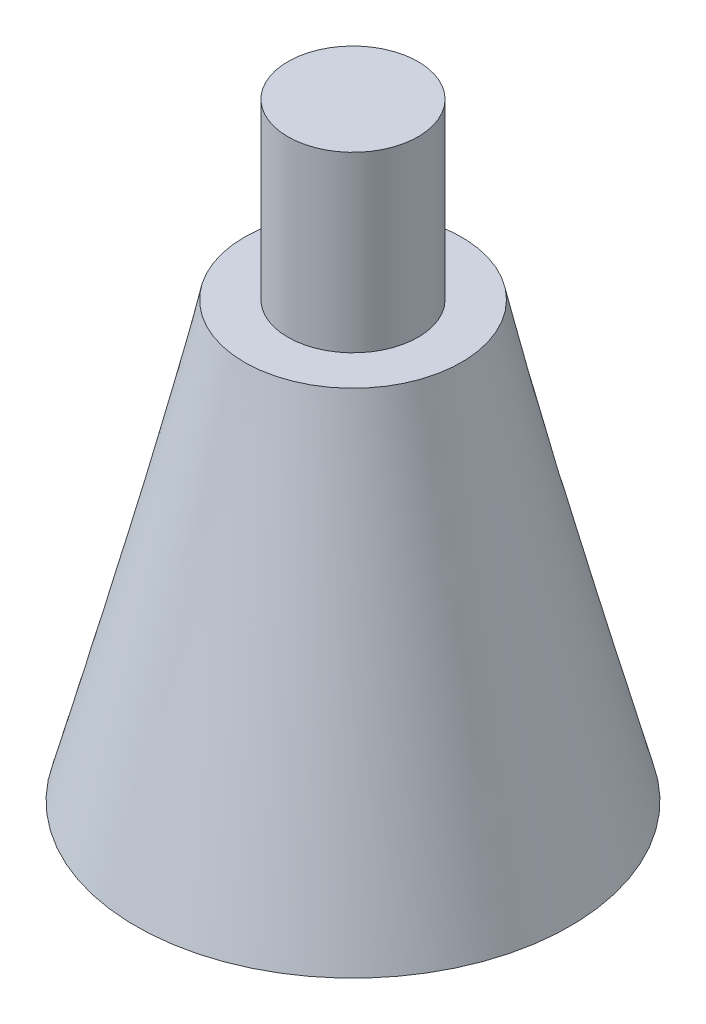
ISO-10303-21;
HEADER;
FILE_DESCRIPTION(('STEP AP214'),'2;1');
FILE_NAME('part.step','',(''),(''),'','','');
FILE_SCHEMA(('AUTOMOTIVE_DESIGN { 1 0 10303 214 1 1 1 1 }'));
ENDSEC;
DATA;
#1=APPLICATION_CONTEXT('core data for automotive mechanical design processes');
#2=APPLICATION_PROTOCOL_DEFINITION('international standard','automotive_design',2000,#1);
#3=PRODUCT_CONTEXT('',#1,'mechanical');
#4=PRODUCT('Part','Part','',(#3));
#5=PRODUCT_RELATED_PRODUCT_CATEGORY('part','',(#4));
#6=PRODUCT_DEFINITION_FORMATION('','',#4);
#7=PRODUCT_DEFINITION_CONTEXT('part definition',#1,'design');
#8=PRODUCT_DEFINITION('design','',#6,#7);
#9=PRODUCT_DEFINITION_SHAPE('','',#8);
#10=(LENGTH_UNIT() NAMED_UNIT(*) SI_UNIT(.MILLI.,.METRE.));
#11=(NAMED_UNIT(*) PLANE_ANGLE_UNIT() SI_UNIT($,.RADIAN.));
#12=(NAMED_UNIT(*) SI_UNIT($,.STERADIAN.) SOLID_ANGLE_UNIT());
#13=UNCERTAINTY_MEASURE_WITH_UNIT(LENGTH_MEASURE(1.E-05),#10,'distance_accuracy_value','');
#14=(GEOMETRIC_REPRESENTATION_CONTEXT(3) GLOBAL_UNCERTAINTY_ASSIGNED_CONTEXT((#13)) GLOBAL_UNIT_ASSIGNED_CONTEXT((#10,
#11,#12)) REPRESENTATION_CONTEXT('',''));
#15=CARTESIAN_POINT('',(0.,0.,0.));
#16=DIRECTION('',(0.,0.,1.));
#17=DIRECTION('',(1.,0.,0.));
#18=AXIS2_PLACEMENT_3D('',#15,#16,#17);
#19=CARTESIAN_POINT('',(0.,8.,0.));
#20=DIRECTION('',(0.,-1.,0.));
#21=DIRECTION('',(0.,0.,-1.));
#22=AXIS2_PLACEMENT_3D('',#19,#20,#21);
#23=CYLINDRICAL_SURFACE('',#22,3.);
#24=CARTESIAN_POINT('',(0.,8.,0.));
#25=DIRECTION('',(0.,1.,0.));
#26=DIRECTION('',(0.,0.,1.));
#27=AXIS2_PLACEMENT_3D('',#24,#25,#26);
#28=CIRCLE('',#27,3.);
#29=CARTESIAN_POINT('',(0.,8.,3.));
#30=VERTEX_POINT('',#29);
#31=EDGE_CURVE('E11',#30,#30,#28,.T.);
#32=ORIENTED_EDGE('',*,*,#31,.F.);
#33=EDGE_LOOP('',(#32));
#34=FACE_BOUND('',#33,.T.);
#35=CARTESIAN_POINT('',(0.,0.,0.));
#36=DIRECTION('',(0.,1.,0.));
#37=DIRECTION('',(0.,0.,1.));
#38=AXIS2_PLACEMENT_3D('',#35,#36,#37);
#39=CIRCLE('',#38,3.);
#40=CARTESIAN_POINT('',(0.,0.,3.));
#41=VERTEX_POINT('',#40);
#42=EDGE_CURVE('E44',#41,#41,#39,.T.);
#43=ORIENTED_EDGE('',*,*,#42,.T.);
#44=EDGE_LOOP('',(#43));
#45=FACE_BOUND('',#44,.T.);
#46=ADVANCED_FACE('F41',(#34,#45),#23,.T.);
#47=CARTESIAN_POINT('',(0.,8.,0.));
#48=DIRECTION('',(0.,1.,0.));
#49=DIRECTION('',(0.,0.,1.));
#50=AXIS2_PLACEMENT_3D('',#47,#48,#49);
#51=PLANE('',#50);
#52=ORIENTED_EDGE('',*,*,#31,.T.);
#53=EDGE_LOOP('',(#52));
#54=FACE_BOUND('',#53,.T.);
#55=ADVANCED_FACE('F76',(#54),#51,.T.);
#56=CARTESIAN_POINT('',(0.,-20.,0.));
#57=DIRECTION('',(0.,-1.,0.));
#58=DIRECTION('',(0.,0.,-1.));
#59=AXIS2_PLACEMENT_3D('',#56,#57,#58);
#60=PLANE('',#59);
#61=CARTESIAN_POINT('',(0.,-20.,0.));
#62=DIRECTION('',(0.,-1.,0.));
#63=DIRECTION('',(0.,0.,-1.));
#64=AXIS2_PLACEMENT_3D('',#61,#62,#63);
#65=CIRCLE('',#64,10.);
#66=CARTESIAN_POINT('',(-2.26719303234321,-20.,9.73960141659269));
#67=VERTEX_POINT('',#66);
#68=EDGE_CURVE('E53',#67,#67,#65,.T.);
#69=ORIENTED_EDGE('',*,*,#68,.T.);
#70=EDGE_LOOP('',(#69));
#71=FACE_BOUND('',#70,.T.);
#72=ADVANCED_FACE('F66',(#71),#60,.T.);
#73=CARTESIAN_POINT('',(0.,0.,0.));
#74=DIRECTION('',(0.,-1.,0.));
#75=DIRECTION('',(0.,0.,-1.));
#76=AXIS2_PLACEMENT_3D('',#73,#74,#75);
#77=PLANE('',#76);
#78=ORIENTED_EDGE('',*,*,#42,.F.);
#79=EDGE_LOOP('',(#78));
#80=FACE_BOUND('',#79,.T.);
#81=CARTESIAN_POINT('',(0.,0.,0.));
#82=DIRECTION('',(0.,-1.,0.));
#83=DIRECTION('',(0.,0.,-1.));
#84=AXIS2_PLACEMENT_3D('',#81,#82,#83);
#85=CIRCLE('',#84,5.);
#86=CARTESIAN_POINT('',(0.685839691295732,0.,4.95273903187351));
#87=VERTEX_POINT('',#86);
#88=EDGE_CURVE('E60',#87,#87,#85,.T.);
#89=ORIENTED_EDGE('',*,*,#88,.F.);
#90=EDGE_LOOP('',(#89));
#91=FACE_BOUND('',#90,.T.);
#92=ADVANCED_FACE('F75',(#80,#91),#77,.F.);
#93=CARTESIAN_POINT('',(0.685839691295732,0.,4.95273903187351));
#94=CARTESIAN_POINT('',(-2.26719303234321,-20.,9.73960141659269));
#95=CARTESIAN_POINT('',(-9.2196383724513,0.,6.32441841446498));
#96=CARTESIAN_POINT('',(-21.7463958655286,-20.,5.20521535190628));
#97=CARTESIAN_POINT('',(-10.5913177550428,0.,-3.58105964928205));
#98=CARTESIAN_POINT('',(-17.2120098008422,-20.,-14.2739874812791));
#99=CARTESIAN_POINT('',(-0.685839691295731,0.,-4.95273903187351));
#100=CARTESIAN_POINT('',(2.26719303234321,-20.,-9.73960141659269));
#101=CARTESIAN_POINT('',(9.21963837245129,0.,-6.32441841446497));
#102=CARTESIAN_POINT('',(21.7463958655286,-20.,-5.20521535190629));
#103=CARTESIAN_POINT('',(10.5913177550428,0.,3.58105964928205));
#104=CARTESIAN_POINT('',(17.2120098008422,-20.,14.2739874812791));
#105=CARTESIAN_POINT('',(0.685839691295732,0.,4.95273903187351));
#106=CARTESIAN_POINT('',(-2.26719303234321,-20.,9.73960141659269));
#107=(BOUNDED_SURFACE() B_SPLINE_SURFACE(3,1,((#93,#94),(#95,#96),(#97,#98),(#99,#100),(#101,
#102),(#103,#104),(#105,#106)),.UNSPECIFIED.,.T.,.F.,.F.) B_SPLINE_SURFACE_WITH_KNOTS((4,3,4),
(2,2),(0.,0.5,1.),(0.,1.),
.UNSPECIFIED.) GEOMETRIC_REPRESENTATION_ITEM() RATIONAL_B_SPLINE_SURFACE(((1.,1.),
(0.333333333333333,0.333333333333334),(0.333333333333333,0.333333333333334),(1.,1.),
(0.333333333333333,0.333333333333333),(0.333333333333333,0.333333333333333),(1.,1.))) REPRESENTATION_ITEM('') SURFACE());
#108=CARTESIAN_POINT('',(0.685839691295732,0.,4.95273903187351));
#109=CARTESIAN_POINT('',(0.655078933757826,-0.208333333333334,5.00260218171434));
#110=CARTESIAN_POINT('',(0.624318176219921,-0.416666666666667,5.05246533155516));
#111=CARTESIAN_POINT('',(0.56279666114411,-0.833333333333333,5.15219163123681));
#112=CARTESIAN_POINT('',(0.532035903606204,-1.04166666666667,5.20205478107764));
#113=CARTESIAN_POINT('',(0.470514388530393,-1.45833333333333,5.30178108075928));
#114=CARTESIAN_POINT('',(0.439753630992487,-1.66666666666667,5.35164423060011));
#115=CARTESIAN_POINT('',(0.378232115916676,-2.08333333333333,5.45137053028176));
#116=CARTESIAN_POINT('',(0.34747135837877,-2.29166666666667,5.50123368012258));
#117=CARTESIAN_POINT('',(0.285949843302959,-2.70833333333333,5.60095997980423));
#118=CARTESIAN_POINT('',(0.255189085765053,-2.91666666666667,5.65082312964506));
#119=CARTESIAN_POINT('',(0.193667570689242,-3.33333333333333,5.75054942932671));
#120=CARTESIAN_POINT('',(0.162906813151336,-3.54166666666667,5.80041257916753));
#121=CARTESIAN_POINT('',(0.101385298075525,-3.95833333333333,5.90013887884918));
#122=CARTESIAN_POINT('',(0.0706245405376194,-4.16666666666667,5.95000202869001));
#123=CARTESIAN_POINT('',(0.00910302546180816,-4.58333333333333,6.04972832837166));
#124=CARTESIAN_POINT('',(-0.0216577320760975,-4.79166666666667,6.09959147821248));
#125=CARTESIAN_POINT('',(-0.0831792471519088,-5.20833333333333,6.19931777789413));
#126=CARTESIAN_POINT('',(-0.113940004689814,-5.41666666666667,6.24918092773496));
#127=CARTESIAN_POINT('',(-0.175461519765626,-5.83333333333333,6.34890722741661));
#128=CARTESIAN_POINT('',(-0.206222277303531,-6.04166666666667,6.39877037725743));
#129=CARTESIAN_POINT('',(-0.267743792379342,-6.45833333333333,6.49849667693908));
#130=CARTESIAN_POINT('',(-0.298504549917248,-6.66666666666667,6.54835982677991));
#131=CARTESIAN_POINT('',(-0.360026064993059,-7.08333333333333,6.64808612646156));
#132=CARTESIAN_POINT('',(-0.390786822530965,-7.29166666666667,6.69794927630238));
#133=CARTESIAN_POINT('',(-0.452308337606776,-7.70833333333333,6.79767557598403));
#134=CARTESIAN_POINT('',(-0.483069095144682,-7.91666666666667,6.84753872582485));
#135=CARTESIAN_POINT('',(-0.544590610220493,-8.33333333333333,6.94726502550651));
#136=CARTESIAN_POINT('',(-0.575351367758399,-8.54166666666667,6.99712817534733));
#137=CARTESIAN_POINT('',(-0.63687288283421,-8.95833333333333,7.09685447502898));
#138=CARTESIAN_POINT('',(-0.667633640372116,-9.16666666666667,7.1467176248698));
#139=CARTESIAN_POINT('',(-0.729155155447927,-9.58333333333333,7.24644392455145));
#140=CARTESIAN_POINT('',(-0.759915912985833,-9.79166666666667,7.29630707439228));
#141=CARTESIAN_POINT('',(-0.821437428061644,-10.2083333333333,7.39603337407393));
#142=CARTESIAN_POINT('',(-0.85219818559955,-10.4166666666667,7.44589652391475));
#143=CARTESIAN_POINT('',(-0.913719700675361,-10.8333333333333,7.5456228235964));
#144=CARTESIAN_POINT('',(-0.944480458213267,-11.0416666666667,7.59548597343723));
#145=CARTESIAN_POINT('',(-1.00600197328908,-11.4583333333333,7.69521227311888));
#146=CARTESIAN_POINT('',(-1.03676273082698,-11.6666666666667,7.7450754229597));
#147=CARTESIAN_POINT('',(-1.09828424590279,-12.0833333333333,7.84480172264135));
#148=CARTESIAN_POINT('',(-1.1290450034407,-12.2916666666667,7.89466487248218));
#149=CARTESIAN_POINT('',(-1.19056651851651,-12.7083333333333,7.99439117216382));
#150=CARTESIAN_POINT('',(-1.22132727605442,-12.9166666666667,8.04425432200465));
#151=CARTESIAN_POINT('',(-1.28284879113023,-13.3333333333333,8.1439806216863));
#152=CARTESIAN_POINT('',(-1.31360954866813,-13.5416666666667,8.19384377152712));
#153=CARTESIAN_POINT('',(-1.37513106374395,-13.9583333333333,8.29357007120877));
#154=CARTESIAN_POINT('',(-1.40589182128185,-14.1666666666667,8.3434332210496));
#155=CARTESIAN_POINT('',(-1.46741333635766,-14.5833333333333,8.44315952073125));
#156=CARTESIAN_POINT('',(-1.49817409389557,-14.7916666666667,8.49302267057207));
#157=CARTESIAN_POINT('',(-1.55969560897138,-15.2083333333333,8.59274897025372));
#158=CARTESIAN_POINT('',(-1.59045636650928,-15.4166666666667,8.64261212009455));
#159=CARTESIAN_POINT('',(-1.6519778815851,-15.8333333333333,8.7423384197762));
#160=CARTESIAN_POINT('',(-1.682738639123,-16.0416666666667,8.79220156961702));
#161=CARTESIAN_POINT('',(-1.74426015419881,-16.4583333333333,8.89192786929867));
#162=CARTESIAN_POINT('',(-1.77502091173672,-16.6666666666667,8.9417910191395));
#163=CARTESIAN_POINT('',(-1.83654242681253,-17.0833333333333,9.04151731882115));
#164=CARTESIAN_POINT('',(-1.86730318435044,-17.2916666666667,9.09138046866197));
#165=CARTESIAN_POINT('',(-1.92882469942625,-17.7083333333333,9.19110676834362));
#166=CARTESIAN_POINT('',(-1.95958545696415,-17.9166666666667,9.24096991818445));
#167=CARTESIAN_POINT('',(-2.02110697203996,-18.3333333333333,9.34069621786609));
#168=CARTESIAN_POINT('',(-2.05186772957787,-18.5416666666667,9.39055936770692));
#169=CARTESIAN_POINT('',(-2.11338924465368,-18.9583333333333,9.49028566738857));
#170=CARTESIAN_POINT('',(-2.14415000219159,-19.1666666666667,9.54014881722939));
#171=CARTESIAN_POINT('',(-2.2056715172674,-19.5833333333333,9.63987511691104));
#172=CARTESIAN_POINT('',(-2.2364322748053,-19.7916666666667,9.68973826675187));
#173=CARTESIAN_POINT('',(-2.26719303234321,-20.,9.73960141659269));
#174=B_SPLINE_CURVE_WITH_KNOTS('',3,(#108,#109,#110,#111,#112,#113,#114,#115,#116,#117,#118,
#119,#120,#121,#122,#123,#124,#125,#126,#127,#128,#129,#130,#131,#132,#133,#134,#135,#136,#137,
#138,#139,#140,#141,#142,#143,#144,#145,#146,#147,#148,#149,#150,#151,#152,#153,#154,#155,#156,
#157,#158,#159,#160,#161,#162,#163,#164,#165,#166,#167,#168,#169,#170,#171,#172,#173),
.UNSPECIFIED.,.F.,.F.,(4,2,2,2,2,2,2,2,2,2,2,2,2,2,2,2,2,2,2,2,2,2,2,2,2,2,2,2,2,2,2,2,4),(0.,
0.649244192309172,1.29848838461834,1.94773257692752,2.59697676923669,3.24622096154586,
3.89546515385503,4.54470934616421,5.19395353847338,5.84319773078255,6.49244192309172,
7.1416861154009,7.79093030771007,8.44017450001924,9.08941869232841,9.73866288463758,
10.3879070769468,11.0371512692559,11.6863954615651,12.3356396538743,12.9848838461834,
13.6341280384926,14.2833722308018,14.932616423111,15.5818606154201,16.2311048077293,
16.8803490000385,17.5295931923476,18.1788373846568,18.828081576966,19.4773257692752,
20.1265699615843,20.7758141538935),.UNSPECIFIED.);
#175=EDGE_CURVE('BSEAM78',#87,#67,#174,.T.);
#176=ORIENTED_EDGE('',*,*,#88,.T.);
#177=ORIENTED_EDGE('',*,*,#68,.F.);
#178=ORIENTED_EDGE('',*,*,#175,.T.);
#179=ORIENTED_EDGE('',*,*,#175,.F.);
#180=EDGE_LOOP('',(#176,#178,#177,#179));
#181=FACE_BOUND('',#180,.T.);
#182=ADVANCED_FACE('F78',(#181),#107,.T.);
#183=CLOSED_SHELL('',(#46,#55,#72,#92,#182));
#184=MANIFOLD_SOLID_BREP('B2',#183);
#185=ADVANCED_BREP_SHAPE_REPRESENTATION('',(#18,#184),#14);
#186=SHAPE_DEFINITION_REPRESENTATION(#9,#185);
ENDSEC;
END-ISO-10303-21;
